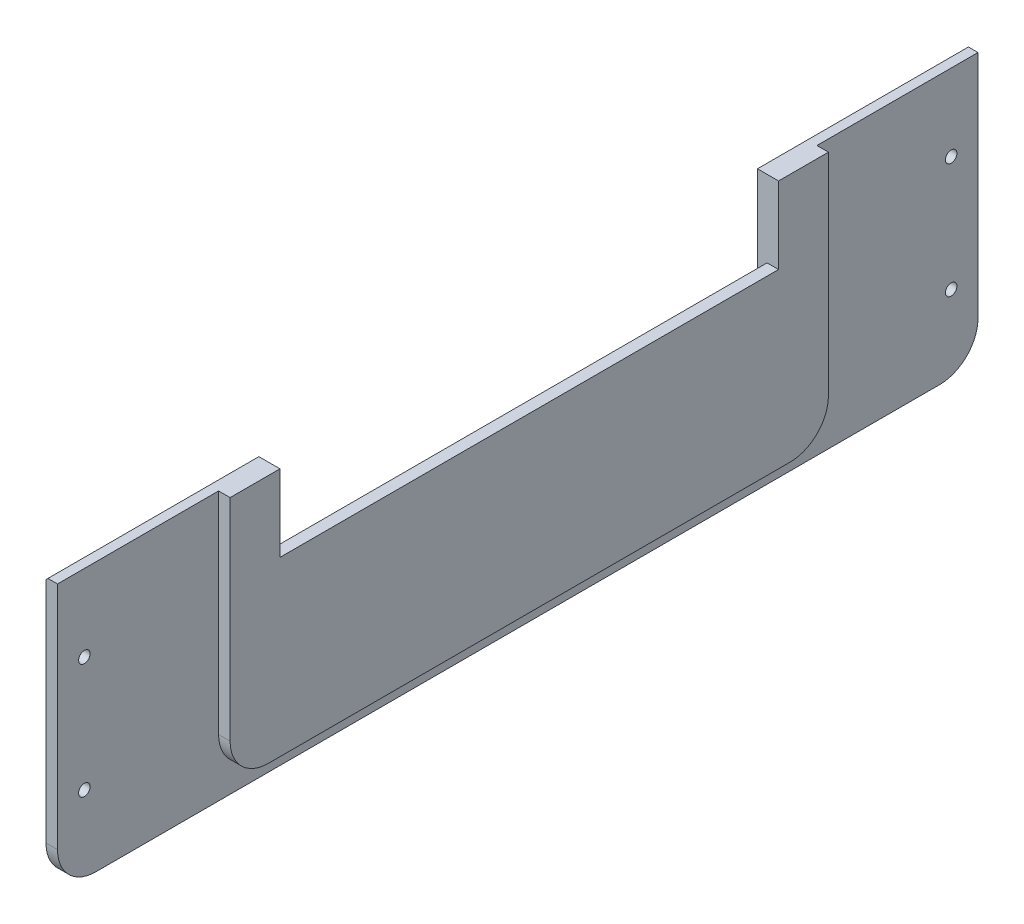
ISO-10303-21;
HEADER;
FILE_DESCRIPTION(('STEP AP214'),'2;1');
FILE_NAME('part.step','',(''),(''),'','','');
FILE_SCHEMA(('AUTOMOTIVE_DESIGN { 1 0 10303 214 1 1 1 1 }'));
ENDSEC;
DATA;
#1=APPLICATION_CONTEXT('core data for automotive mechanical design processes');
#2=APPLICATION_PROTOCOL_DEFINITION('international standard','automotive_design',2000,#1);
#3=PRODUCT_CONTEXT('',#1,'mechanical');
#4=PRODUCT('Part','Part','',(#3));
#5=PRODUCT_RELATED_PRODUCT_CATEGORY('part','',(#4));
#6=PRODUCT_DEFINITION_FORMATION('','',#4);
#7=PRODUCT_DEFINITION_CONTEXT('part definition',#1,'design');
#8=PRODUCT_DEFINITION('design','',#6,#7);
#9=PRODUCT_DEFINITION_SHAPE('','',#8);
#10=(LENGTH_UNIT() NAMED_UNIT(*) SI_UNIT(.MILLI.,.METRE.));
#11=(NAMED_UNIT(*) PLANE_ANGLE_UNIT() SI_UNIT($,.RADIAN.));
#12=(NAMED_UNIT(*) SI_UNIT($,.STERADIAN.) SOLID_ANGLE_UNIT());
#13=UNCERTAINTY_MEASURE_WITH_UNIT(LENGTH_MEASURE(1.E-05),#10,'distance_accuracy_value','');
#14=(GEOMETRIC_REPRESENTATION_CONTEXT(3) GLOBAL_UNCERTAINTY_ASSIGNED_CONTEXT((#13)) GLOBAL_UNIT_ASSIGNED_CONTEXT((#10,
#11,#12)) REPRESENTATION_CONTEXT('',''));
#15=CARTESIAN_POINT('',(0.,0.,0.));
#16=DIRECTION('',(0.,0.,1.));
#17=DIRECTION('',(1.,0.,0.));
#18=AXIS2_PLACEMENT_3D('',#15,#16,#17);
#19=CARTESIAN_POINT('',(3.,45.,120.));
#20=DIRECTION('',(0.,-1.,0.));
#21=DIRECTION('',(0.,0.,-1.));
#22=AXIS2_PLACEMENT_3D('',#19,#20,#21);
#23=PLANE('',#22);
#24=DIRECTION('',(-1.,0.,0.));
#25=VECTOR('',#24,1.);
#26=CARTESIAN_POINT('',(3.,45.,-120.));
#27=LINE('',#26,#25);
#28=CARTESIAN_POINT('',(3.,45.,-120.));
#29=VERTEX_POINT('',#28);
#30=CARTESIAN_POINT('',(0.499999999999973,45.,-120.));
#31=VERTEX_POINT('',#30);
#32=EDGE_CURVE('E349',#29,#31,#27,.T.);
#33=ORIENTED_EDGE('',*,*,#32,.T.);
#34=DIRECTION('',(0.,0.,1.));
#35=VECTOR('',#34,1.);
#36=CARTESIAN_POINT('',(0.499999999999973,45.,120.));
#37=LINE('',#36,#35);
#38=CARTESIAN_POINT('',(0.499999999999973,45.,-65.));
#39=VERTEX_POINT('',#38);
#40=EDGE_CURVE('E419',#31,#39,#37,.T.);
#41=ORIENTED_EDGE('',*,*,#40,.T.);
#42=DIRECTION('',(-1.,0.,0.));
#43=VECTOR('',#42,1.);
#44=CARTESIAN_POINT('',(3.,45.,-65.));
#45=LINE('',#44,#43);
#46=CARTESIAN_POINT('',(6.,45.,-65.));
#47=VERTEX_POINT('',#46);
#48=EDGE_CURVE('E239',#47,#39,#45,.T.);
#49=ORIENTED_EDGE('',*,*,#48,.F.);
#50=DIRECTION('',(0.,0.,1.));
#51=VECTOR('',#50,1.);
#52=CARTESIAN_POINT('',(6.,45.,78.));
#53=LINE('',#52,#51);
#54=CARTESIAN_POINT('',(6.,45.,-78.));
#55=VERTEX_POINT('',#54);
#56=EDGE_CURVE('E218',#55,#47,#53,.T.);
#57=ORIENTED_EDGE('',*,*,#56,.F.);
#58=DIRECTION('',(-1.,0.,0.));
#59=VECTOR('',#58,1.);
#60=CARTESIAN_POINT('',(6.,45.,-78.));
#61=LINE('',#60,#59);
#62=CARTESIAN_POINT('',(3.,45.,-78.));
#63=VERTEX_POINT('',#62);
#64=EDGE_CURVE('E314',#55,#63,#61,.T.);
#65=ORIENTED_EDGE('',*,*,#64,.T.);
#66=DIRECTION('',(0.,0.,1.));
#67=VECTOR('',#66,1.);
#68=CARTESIAN_POINT('',(3.,45.,120.));
#69=LINE('',#68,#67);
#70=EDGE_CURVE('E332',#29,#63,#69,.T.);
#71=ORIENTED_EDGE('',*,*,#70,.F.);
#72=EDGE_LOOP('',(#33,#41,#49,#57,#65,#71));
#73=FACE_BOUND('',#72,.T.);
#74=ADVANCED_FACE('F47',(#73),#23,.F.);
#75=CARTESIAN_POINT('',(3.,45.,120.));
#76=DIRECTION('',(0.,0.,-1.));
#77=DIRECTION('',(0.,1.,0.));
#78=AXIS2_PLACEMENT_3D('',#75,#76,#77);
#79=PLANE('',#78);
#80=DIRECTION('',(-1.,0.,0.));
#81=VECTOR('',#80,1.);
#82=CARTESIAN_POINT('',(3.,45.,120.));
#83=LINE('',#82,#81);
#84=CARTESIAN_POINT('',(3.,45.,120.));
#85=VERTEX_POINT('',#84);
#86=CARTESIAN_POINT('',(0.499999999999973,45.,120.));
#87=VERTEX_POINT('',#86);
#88=EDGE_CURVE('E336',#85,#87,#83,.T.);
#89=ORIENTED_EDGE('',*,*,#88,.T.);
#90=DIRECTION('',(0.707106781186548,0.707106781186548,0.));
#91=VECTOR('',#90,1.);
#92=CARTESIAN_POINT('',(0.499999999999973,45.,120.));
#93=LINE('',#92,#91);
#94=CARTESIAN_POINT('',(0.,44.5,120.));
#95=VERTEX_POINT('',#94);
#96=EDGE_CURVE('E410',#87,#95,#93,.F.);
#97=ORIENTED_EDGE('',*,*,#96,.T.);
#98=DIRECTION('',(0.,-1.,0.));
#99=VECTOR('',#98,1.);
#100=CARTESIAN_POINT('',(0.,45.,120.));
#101=LINE('',#100,#99);
#102=CARTESIAN_POINT('',(0.,-15.,120.));
#103=VERTEX_POINT('',#102);
#104=EDGE_CURVE('E318',#95,#103,#101,.T.);
#105=ORIENTED_EDGE('',*,*,#104,.T.);
#106=DIRECTION('',(-1.,0.,0.));
#107=VECTOR('',#106,1.);
#108=CARTESIAN_POINT('',(3.,-15.,120.));
#109=LINE('',#108,#107);
#110=CARTESIAN_POINT('',(3.,-15.,120.));
#111=VERTEX_POINT('',#110);
#112=EDGE_CURVE('E367',#103,#111,#109,.F.);
#113=ORIENTED_EDGE('',*,*,#112,.T.);
#114=DIRECTION('',(0.,-1.,0.));
#115=VECTOR('',#114,1.);
#116=CARTESIAN_POINT('',(3.,45.,120.));
#117=LINE('',#116,#115);
#118=EDGE_CURVE('E319',#85,#111,#117,.T.);
#119=ORIENTED_EDGE('',*,*,#118,.F.);
#120=EDGE_LOOP('',(#89,#97,#105,#113,#119));
#121=FACE_BOUND('',#120,.T.);
#122=ADVANCED_FACE('F511',(#121),#79,.F.);
#123=CARTESIAN_POINT('',(3.,-25.,120.));
#124=DIRECTION('',(0.,1.,0.));
#125=DIRECTION('',(0.,0.,1.));
#126=AXIS2_PLACEMENT_3D('',#123,#124,#125);
#127=PLANE('',#126);
#128=DIRECTION('',(0.,0.,-1.));
#129=VECTOR('',#128,1.);
#130=CARTESIAN_POINT('',(3.,-25.,120.));
#131=LINE('',#130,#129);
#132=CARTESIAN_POINT('',(3.,-25.,110.));
#133=VERTEX_POINT('',#132);
#134=CARTESIAN_POINT('',(3.,-25.,-110.));
#135=VERTEX_POINT('',#134);
#136=EDGE_CURVE('E323',#133,#135,#131,.T.);
#137=ORIENTED_EDGE('',*,*,#136,.F.);
#138=DIRECTION('',(-1.,0.,0.));
#139=VECTOR('',#138,1.);
#140=CARTESIAN_POINT('',(3.,-25.,110.));
#141=LINE('',#140,#139);
#142=CARTESIAN_POINT('',(0.,-25.,110.));
#143=VERTEX_POINT('',#142);
#144=EDGE_CURVE('E356',#133,#143,#141,.T.);
#145=ORIENTED_EDGE('',*,*,#144,.T.);
#146=DIRECTION('',(0.,0.,-1.));
#147=VECTOR('',#146,1.);
#148=CARTESIAN_POINT('',(0.,-25.,120.));
#149=LINE('',#148,#147);
#150=CARTESIAN_POINT('',(0.,-25.,-110.));
#151=VERTEX_POINT('',#150);
#152=EDGE_CURVE('E339',#143,#151,#149,.T.);
#153=ORIENTED_EDGE('',*,*,#152,.T.);
#154=DIRECTION('',(-1.,0.,0.));
#155=VECTOR('',#154,1.);
#156=CARTESIAN_POINT('',(3.,-25.,-110.));
#157=LINE('',#156,#155);
#158=EDGE_CURVE('E353',#151,#135,#157,.F.);
#159=ORIENTED_EDGE('',*,*,#158,.T.);
#160=EDGE_LOOP('',(#137,#145,#153,#159));
#161=FACE_BOUND('',#160,.T.);
#162=ADVANCED_FACE('F485',(#161),#127,.F.);
#163=CARTESIAN_POINT('',(3.,45.,-120.));
#164=DIRECTION('',(0.,0.,1.));
#165=DIRECTION('',(1.,0.,0.));
#166=AXIS2_PLACEMENT_3D('',#163,#164,#165);
#167=PLANE('',#166);
#168=DIRECTION('',(0.,1.,0.));
#169=VECTOR('',#168,1.);
#170=CARTESIAN_POINT('',(0.,45.,-120.));
#171=LINE('',#170,#169);
#172=CARTESIAN_POINT('',(0.,-15.,-120.));
#173=VERTEX_POINT('',#172);
#174=CARTESIAN_POINT('',(0.,44.5,-120.));
#175=VERTEX_POINT('',#174);
#176=EDGE_CURVE('E324',#173,#175,#171,.T.);
#177=ORIENTED_EDGE('',*,*,#176,.T.);
#178=DIRECTION('',(-0.707106781186548,-0.707106781186548,0.));
#179=VECTOR('',#178,1.);
#180=CARTESIAN_POINT('',(0.499999999999973,45.,-120.));
#181=LINE('',#180,#179);
#182=EDGE_CURVE('E423',#175,#31,#181,.F.);
#183=ORIENTED_EDGE('',*,*,#182,.T.);
#184=ORIENTED_EDGE('',*,*,#32,.F.);
#185=DIRECTION('',(0.,1.,0.));
#186=VECTOR('',#185,1.);
#187=CARTESIAN_POINT('',(3.,45.,-120.));
#188=LINE('',#187,#186);
#189=CARTESIAN_POINT('',(3.,-15.,-120.));
#190=VERTEX_POINT('',#189);
#191=EDGE_CURVE('E328',#190,#29,#188,.T.);
#192=ORIENTED_EDGE('',*,*,#191,.F.);
#193=DIRECTION('',(-1.,0.,0.));
#194=VECTOR('',#193,1.);
#195=CARTESIAN_POINT('',(3.,-15.,-120.));
#196=LINE('',#195,#194);
#197=EDGE_CURVE('E376',#190,#173,#196,.T.);
#198=ORIENTED_EDGE('',*,*,#197,.T.);
#199=EDGE_LOOP('',(#177,#183,#184,#192,#198));
#200=FACE_BOUND('',#199,.T.);
#201=ADVANCED_FACE('F469',(#200),#167,.F.);
#202=DIRECTION('',(-1.,0.,0.));
#203=VECTOR('',#202,1.);
#204=CARTESIAN_POINT('',(3.,45.,65.));
#205=LINE('',#204,#203);
#206=CARTESIAN_POINT('',(6.,45.,65.));
#207=VERTEX_POINT('',#206);
#208=CARTESIAN_POINT('',(0.499999999999973,45.,65.));
#209=VERTEX_POINT('',#208);
#210=EDGE_CURVE('E240',#207,#209,#205,.T.);
#211=ORIENTED_EDGE('',*,*,#210,.T.);
#212=DIRECTION('',(0.,0.,1.));
#213=VECTOR('',#212,1.);
#214=CARTESIAN_POINT('',(0.499999999999973,45.,120.));
#215=LINE('',#214,#213);
#216=EDGE_CURVE('E406',#209,#87,#215,.T.);
#217=ORIENTED_EDGE('',*,*,#216,.T.);
#218=ORIENTED_EDGE('',*,*,#88,.F.);
#219=CARTESIAN_POINT('',(3.,45.,78.));
#220=VERTEX_POINT('',#219);
#221=EDGE_CURVE('E331',#220,#85,#69,.T.);
#222=ORIENTED_EDGE('',*,*,#221,.F.);
#223=DIRECTION('',(-1.,0.,0.));
#224=VECTOR('',#223,1.);
#225=CARTESIAN_POINT('',(6.,45.,78.));
#226=LINE('',#225,#224);
#227=CARTESIAN_POINT('',(6.,45.,78.));
#228=VERTEX_POINT('',#227);
#229=EDGE_CURVE('E301',#228,#220,#226,.T.);
#230=ORIENTED_EDGE('',*,*,#229,.F.);
#231=EDGE_CURVE('E298',#207,#228,#53,.T.);
#232=ORIENTED_EDGE('',*,*,#231,.F.);
#233=EDGE_LOOP('',(#211,#217,#218,#222,#230,#232));
#234=FACE_BOUND('',#233,.T.);
#235=ADVANCED_FACE('F503',(#234),#23,.F.);
#236=CARTESIAN_POINT('',(3.,0.,0.));
#237=DIRECTION('',(1.,0.,0.));
#238=DIRECTION('',(0.,0.,-1.));
#239=AXIS2_PLACEMENT_3D('',#236,#237,#238);
#240=PLANE('',#239);
#241=CARTESIAN_POINT('',(3.,25.,-113.));
#242=DIRECTION('',(1.,0.,0.));
#243=DIRECTION('',(0.,0.,-1.));
#244=AXIS2_PLACEMENT_3D('',#241,#242,#243);
#245=CIRCLE('',#244,1.5);
#246=CARTESIAN_POINT('',(3.,25.,-114.5));
#247=VERTEX_POINT('',#246);
#248=EDGE_CURVE('E281',#247,#247,#245,.T.);
#249=ORIENTED_EDGE('',*,*,#248,.F.);
#250=EDGE_LOOP('',(#249));
#251=FACE_BOUND('',#250,.T.);
#252=CARTESIAN_POINT('',(3.,-5.00000000000003,-113.));
#253=DIRECTION('',(1.,0.,0.));
#254=DIRECTION('',(0.,0.,-1.));
#255=AXIS2_PLACEMENT_3D('',#252,#253,#254);
#256=CIRCLE('',#255,1.5);
#257=CARTESIAN_POINT('',(3.,-5.00000000000003,-114.5));
#258=VERTEX_POINT('',#257);
#259=EDGE_CURVE('E277',#258,#258,#256,.T.);
#260=ORIENTED_EDGE('',*,*,#259,.F.);
#261=EDGE_LOOP('',(#260));
#262=FACE_BOUND('',#261,.T.);
#263=CARTESIAN_POINT('',(3.,-5.,113.));
#264=DIRECTION('',(1.,0.,0.));
#265=DIRECTION('',(0.,0.,-1.));
#266=AXIS2_PLACEMENT_3D('',#263,#264,#265);
#267=CIRCLE('',#266,1.5);
#268=CARTESIAN_POINT('',(3.,-5.,111.5));
#269=VERTEX_POINT('',#268);
#270=EDGE_CURVE('E273',#269,#269,#267,.T.);
#271=ORIENTED_EDGE('',*,*,#270,.F.);
#272=EDGE_LOOP('',(#271));
#273=FACE_BOUND('',#272,.T.);
#274=CARTESIAN_POINT('',(3.,25.,113.));
#275=DIRECTION('',(1.,0.,0.));
#276=DIRECTION('',(0.,0.,-1.));
#277=AXIS2_PLACEMENT_3D('',#274,#275,#276);
#278=CIRCLE('',#277,1.5);
#279=CARTESIAN_POINT('',(3.,25.,111.5));
#280=VERTEX_POINT('',#279);
#281=EDGE_CURVE('E269',#280,#280,#278,.T.);
#282=ORIENTED_EDGE('',*,*,#281,.F.);
#283=EDGE_LOOP('',(#282));
#284=FACE_BOUND('',#283,.T.);
#285=ORIENTED_EDGE('',*,*,#118,.T.);
#286=CARTESIAN_POINT('',(3.,-15.,110.));
#287=DIRECTION('',(1.,0.,0.));
#288=DIRECTION('',(0.,0.,-1.));
#289=AXIS2_PLACEMENT_3D('',#286,#287,#288);
#290=CIRCLE('',#289,10.);
#291=EDGE_CURVE('E373',#111,#133,#290,.T.);
#292=ORIENTED_EDGE('',*,*,#291,.T.);
#293=ORIENTED_EDGE('',*,*,#136,.T.);
#294=CARTESIAN_POINT('',(3.,-15.,-110.));
#295=DIRECTION('',(1.,0.,0.));
#296=DIRECTION('',(0.,0.,-1.));
#297=AXIS2_PLACEMENT_3D('',#294,#295,#296);
#298=CIRCLE('',#297,10.);
#299=EDGE_CURVE('E370',#135,#190,#298,.T.);
#300=ORIENTED_EDGE('',*,*,#299,.T.);
#301=ORIENTED_EDGE('',*,*,#191,.T.);
#302=ORIENTED_EDGE('',*,*,#70,.T.);
#303=DIRECTION('',(0.,1.,0.));
#304=VECTOR('',#303,1.);
#305=CARTESIAN_POINT('',(3.,45.,-78.));
#306=LINE('',#305,#304);
#307=CARTESIAN_POINT('',(3.,-9.99999999999999,-78.));
#308=VERTEX_POINT('',#307);
#309=EDGE_CURVE('E291',#308,#63,#306,.T.);
#310=ORIENTED_EDGE('',*,*,#309,.F.);
#311=CARTESIAN_POINT('',(3.,-9.99999999999999,-68.));
#312=DIRECTION('',(1.,0.,0.));
#313=DIRECTION('',(0.,0.,-1.));
#314=AXIS2_PLACEMENT_3D('',#311,#312,#313);
#315=CIRCLE('',#314,10.);
#316=CARTESIAN_POINT('',(3.,-20.,-68.));
#317=VERTEX_POINT('',#316);
#318=EDGE_CURVE('E403',#308,#317,#315,.F.);
#319=ORIENTED_EDGE('',*,*,#318,.T.);
#320=DIRECTION('',(0.,0.,-1.));
#321=VECTOR('',#320,1.);
#322=CARTESIAN_POINT('',(3.,-20.,78.));
#323=LINE('',#322,#321);
#324=CARTESIAN_POINT('',(3.,-20.,68.));
#325=VERTEX_POINT('',#324);
#326=EDGE_CURVE('E305',#325,#317,#323,.T.);
#327=ORIENTED_EDGE('',*,*,#326,.F.);
#328=CARTESIAN_POINT('',(3.,-10.,68.));
#329=DIRECTION('',(1.,0.,0.));
#330=DIRECTION('',(0.,0.,-1.));
#331=AXIS2_PLACEMENT_3D('',#328,#329,#330);
#332=CIRCLE('',#331,10.);
#333=CARTESIAN_POINT('',(3.,-9.99999999999999,78.));
#334=VERTEX_POINT('',#333);
#335=EDGE_CURVE('E400',#325,#334,#332,.F.);
#336=ORIENTED_EDGE('',*,*,#335,.T.);
#337=DIRECTION('',(0.,-1.,0.));
#338=VECTOR('',#337,1.);
#339=CARTESIAN_POINT('',(3.,45.,78.));
#340=LINE('',#339,#338);
#341=EDGE_CURVE('E285',#220,#334,#340,.T.);
#342=ORIENTED_EDGE('',*,*,#341,.F.);
#343=ORIENTED_EDGE('',*,*,#221,.T.);
#344=EDGE_LOOP('',(#285,#292,#293,#300,#301,#302,#310,#319,#327,#336,#342,#343));
#345=FACE_BOUND('',#344,.T.);
#346=ADVANCED_FACE('F476',(#251,#262,#273,#284,#345),#240,.T.);
#347=CARTESIAN_POINT('',(0.,0.,0.));
#348=DIRECTION('',(1.,0.,0.));
#349=DIRECTION('',(0.,0.,-1.));
#350=AXIS2_PLACEMENT_3D('',#347,#348,#349);
#351=PLANE('',#350);
#352=CARTESIAN_POINT('',(0.,25.,-113.));
#353=DIRECTION('',(-1.,0.,0.));
#354=DIRECTION('',(0.,0.,-1.));
#355=AXIS2_PLACEMENT_3D('',#352,#353,#354);
#356=CIRCLE('',#355,1.5);
#357=CARTESIAN_POINT('',(0.,25.,-114.5));
#358=VERTEX_POINT('',#357);
#359=EDGE_CURVE('E244',#358,#358,#356,.T.);
#360=ORIENTED_EDGE('',*,*,#359,.F.);
#361=EDGE_LOOP('',(#360));
#362=FACE_BOUND('',#361,.T.);
#363=CARTESIAN_POINT('',(0.,-5.00000000000003,-113.));
#364=DIRECTION('',(-1.,0.,0.));
#365=DIRECTION('',(0.,0.,-1.));
#366=AXIS2_PLACEMENT_3D('',#363,#364,#365);
#367=CIRCLE('',#366,1.5);
#368=CARTESIAN_POINT('',(0.,-5.00000000000003,-114.5));
#369=VERTEX_POINT('',#368);
#370=EDGE_CURVE('E259',#369,#369,#367,.T.);
#371=ORIENTED_EDGE('',*,*,#370,.F.);
#372=EDGE_LOOP('',(#371));
#373=FACE_BOUND('',#372,.T.);
#374=CARTESIAN_POINT('',(0.,-5.,113.));
#375=DIRECTION('',(-1.,0.,0.));
#376=DIRECTION('',(0.,0.,1.));
#377=AXIS2_PLACEMENT_3D('',#374,#375,#376);
#378=CIRCLE('',#377,1.5);
#379=CARTESIAN_POINT('',(0.,-5.,114.5));
#380=VERTEX_POINT('',#379);
#381=EDGE_CURVE('E254',#380,#380,#378,.T.);
#382=ORIENTED_EDGE('',*,*,#381,.F.);
#383=EDGE_LOOP('',(#382));
#384=FACE_BOUND('',#383,.T.);
#385=CARTESIAN_POINT('',(0.,25.,113.));
#386=DIRECTION('',(-1.,0.,0.));
#387=DIRECTION('',(0.,0.,1.));
#388=AXIS2_PLACEMENT_3D('',#385,#386,#387);
#389=CIRCLE('',#388,1.5);
#390=CARTESIAN_POINT('',(0.,25.,114.5));
#391=VERTEX_POINT('',#390);
#392=EDGE_CURVE('E258',#391,#391,#389,.T.);
#393=ORIENTED_EDGE('',*,*,#392,.F.);
#394=EDGE_LOOP('',(#393));
#395=FACE_BOUND('',#394,.T.);
#396=DIRECTION('',(0.,0.,-1.));
#397=VECTOR('',#396,1.);
#398=CARTESIAN_POINT('',(0.,44.5,0.));
#399=LINE('',#398,#397);
#400=CARTESIAN_POINT('',(0.,44.5,65.5));
#401=VERTEX_POINT('',#400);
#402=EDGE_CURVE('E416',#95,#401,#399,.T.);
#403=ORIENTED_EDGE('',*,*,#402,.T.);
#404=DIRECTION('',(0.,-1.,0.));
#405=VECTOR('',#404,1.);
#406=CARTESIAN_POINT('',(0.,0.,65.5));
#407=LINE('',#406,#405);
#408=CARTESIAN_POINT('',(0.,9.50000000000003,65.5));
#409=VERTEX_POINT('',#408);
#410=EDGE_CURVE('E73',#401,#409,#407,.T.);
#411=ORIENTED_EDGE('',*,*,#410,.T.);
#412=DIRECTION('',(0.,0.,-1.));
#413=VECTOR('',#412,1.);
#414=CARTESIAN_POINT('',(0.,9.50000000000003,0.));
#415=LINE('',#414,#413);
#416=CARTESIAN_POINT('',(0.,9.50000000000003,-65.5));
#417=VERTEX_POINT('',#416);
#418=EDGE_CURVE('E436',#409,#417,#415,.T.);
#419=ORIENTED_EDGE('',*,*,#418,.T.);
#420=DIRECTION('',(0.,1.,0.));
#421=VECTOR('',#420,1.);
#422=CARTESIAN_POINT('',(0.,0.,-65.5));
#423=LINE('',#422,#421);
#424=CARTESIAN_POINT('',(0.,44.5,-65.5));
#425=VERTEX_POINT('',#424);
#426=EDGE_CURVE('E433',#417,#425,#423,.T.);
#427=ORIENTED_EDGE('',*,*,#426,.T.);
#428=DIRECTION('',(0.,0.,-1.));
#429=VECTOR('',#428,1.);
#430=CARTESIAN_POINT('',(0.,44.5,0.));
#431=LINE('',#430,#429);
#432=EDGE_CURVE('E413',#425,#175,#431,.T.);
#433=ORIENTED_EDGE('',*,*,#432,.T.);
#434=ORIENTED_EDGE('',*,*,#176,.F.);
#435=CARTESIAN_POINT('',(0.,-15.,-110.));
#436=DIRECTION('',(1.,0.,0.));
#437=DIRECTION('',(0.,0.,-1.));
#438=AXIS2_PLACEMENT_3D('',#435,#436,#437);
#439=CIRCLE('',#438,10.);
#440=EDGE_CURVE('E360',#173,#151,#439,.F.);
#441=ORIENTED_EDGE('',*,*,#440,.T.);
#442=ORIENTED_EDGE('',*,*,#152,.F.);
#443=CARTESIAN_POINT('',(0.,-15.,110.));
#444=DIRECTION('',(1.,0.,0.));
#445=DIRECTION('',(0.,0.,-1.));
#446=AXIS2_PLACEMENT_3D('',#443,#444,#445);
#447=CIRCLE('',#446,10.);
#448=EDGE_CURVE('E363',#143,#103,#447,.F.);
#449=ORIENTED_EDGE('',*,*,#448,.T.);
#450=ORIENTED_EDGE('',*,*,#104,.F.);
#451=EDGE_LOOP('',(#403,#411,#419,#427,#433,#434,#441,#442,#449,#450));
#452=FACE_BOUND('',#451,.T.);
#453=ADVANCED_FACE('F461',(#362,#373,#384,#395,#452),#351,.F.);
#454=CARTESIAN_POINT('',(6.,45.,78.));
#455=DIRECTION('',(0.,0.,-1.));
#456=DIRECTION('',(0.,1.,0.));
#457=AXIS2_PLACEMENT_3D('',#454,#455,#456);
#458=PLANE('',#457);
#459=ORIENTED_EDGE('',*,*,#341,.T.);
#460=DIRECTION('',(-1.,0.,0.));
#461=VECTOR('',#460,1.);
#462=CARTESIAN_POINT('',(6.,-9.99999999999999,78.));
#463=LINE('',#462,#461);
#464=CARTESIAN_POINT('',(6.,-9.99999999999999,78.));
#465=VERTEX_POINT('',#464);
#466=EDGE_CURVE('E387',#334,#465,#463,.F.);
#467=ORIENTED_EDGE('',*,*,#466,.T.);
#468=DIRECTION('',(0.,-1.,0.));
#469=VECTOR('',#468,1.);
#470=CARTESIAN_POINT('',(6.,45.,78.));
#471=LINE('',#470,#469);
#472=EDGE_CURVE('E286',#228,#465,#471,.T.);
#473=ORIENTED_EDGE('',*,*,#472,.F.);
#474=ORIENTED_EDGE('',*,*,#229,.T.);
#475=EDGE_LOOP('',(#459,#467,#473,#474));
#476=FACE_BOUND('',#475,.T.);
#477=ADVANCED_FACE('F603',(#476),#458,.F.);
#478=CARTESIAN_POINT('',(6.,-20.,78.));
#479=DIRECTION('',(0.,1.,0.));
#480=DIRECTION('',(0.,0.,1.));
#481=AXIS2_PLACEMENT_3D('',#478,#479,#480);
#482=PLANE('',#481);
#483=DIRECTION('',(0.,0.,-1.));
#484=VECTOR('',#483,1.);
#485=CARTESIAN_POINT('',(6.,-20.,78.));
#486=LINE('',#485,#484);
#487=CARTESIAN_POINT('',(6.,-20.,68.));
#488=VERTEX_POINT('',#487);
#489=CARTESIAN_POINT('',(6.,-20.,-68.));
#490=VERTEX_POINT('',#489);
#491=EDGE_CURVE('E290',#488,#490,#486,.T.);
#492=ORIENTED_EDGE('',*,*,#491,.F.);
#493=DIRECTION('',(-1.,0.,0.));
#494=VECTOR('',#493,1.);
#495=CARTESIAN_POINT('',(6.,-20.,68.));
#496=LINE('',#495,#494);
#497=EDGE_CURVE('E383',#488,#325,#496,.T.);
#498=ORIENTED_EDGE('',*,*,#497,.T.);
#499=ORIENTED_EDGE('',*,*,#326,.T.);
#500=DIRECTION('',(-1.,0.,0.));
#501=VECTOR('',#500,1.);
#502=CARTESIAN_POINT('',(6.,-20.,-68.));
#503=LINE('',#502,#501);
#504=EDGE_CURVE('E380',#317,#490,#503,.F.);
#505=ORIENTED_EDGE('',*,*,#504,.T.);
#506=EDGE_LOOP('',(#492,#498,#499,#505));
#507=FACE_BOUND('',#506,.T.);
#508=ADVANCED_FACE('F648',(#507),#482,.F.);
#509=CARTESIAN_POINT('',(6.,45.,-78.));
#510=DIRECTION('',(0.,0.,1.));
#511=DIRECTION('',(0.,-1.,0.));
#512=AXIS2_PLACEMENT_3D('',#509,#510,#511);
#513=PLANE('',#512);
#514=DIRECTION('',(0.,1.,0.));
#515=VECTOR('',#514,1.);
#516=CARTESIAN_POINT('',(6.,45.,-78.));
#517=LINE('',#516,#515);
#518=CARTESIAN_POINT('',(6.,-9.99999999999999,-78.));
#519=VERTEX_POINT('',#518);
#520=EDGE_CURVE('E295',#519,#55,#517,.T.);
#521=ORIENTED_EDGE('',*,*,#520,.F.);
#522=DIRECTION('',(-1.,0.,0.));
#523=VECTOR('',#522,1.);
#524=CARTESIAN_POINT('',(6.,-9.99999999999999,-78.));
#525=LINE('',#524,#523);
#526=EDGE_CURVE('E396',#519,#308,#525,.T.);
#527=ORIENTED_EDGE('',*,*,#526,.T.);
#528=ORIENTED_EDGE('',*,*,#309,.T.);
#529=ORIENTED_EDGE('',*,*,#64,.F.);
#530=EDGE_LOOP('',(#521,#527,#528,#529));
#531=FACE_BOUND('',#530,.T.);
#532=ADVANCED_FACE('F657',(#531),#513,.F.);
#533=CARTESIAN_POINT('',(6.,0.,0.));
#534=DIRECTION('',(1.,0.,0.));
#535=DIRECTION('',(0.,0.,-1.));
#536=AXIS2_PLACEMENT_3D('',#533,#534,#535);
#537=PLANE('',#536);
#538=DIRECTION('',(0.,-1.,0.));
#539=VECTOR('',#538,1.);
#540=CARTESIAN_POINT('',(6.,45.,-65.));
#541=LINE('',#540,#539);
#542=CARTESIAN_POINT('',(6.,25.,-65.));
#543=VERTEX_POINT('',#542);
#544=EDGE_CURVE('E198',#47,#543,#541,.T.);
#545=ORIENTED_EDGE('',*,*,#544,.T.);
#546=DIRECTION('',(0.,0.,1.));
#547=VECTOR('',#546,1.);
#548=CARTESIAN_POINT('',(6.,25.,-65.));
#549=LINE('',#548,#547);
#550=CARTESIAN_POINT('',(6.,25.,65.));
#551=VERTEX_POINT('',#550);
#552=EDGE_CURVE('E209',#543,#551,#549,.T.);
#553=ORIENTED_EDGE('',*,*,#552,.T.);
#554=DIRECTION('',(0.,1.,0.));
#555=VECTOR('',#554,1.);
#556=CARTESIAN_POINT('',(6.,45.,65.));
#557=LINE('',#556,#555);
#558=EDGE_CURVE('E206',#551,#207,#557,.T.);
#559=ORIENTED_EDGE('',*,*,#558,.T.);
#560=ORIENTED_EDGE('',*,*,#231,.T.);
#561=ORIENTED_EDGE('',*,*,#472,.T.);
#562=CARTESIAN_POINT('',(6.,-10.,68.));
#563=DIRECTION('',(1.,0.,0.));
#564=DIRECTION('',(0.,0.,-1.));
#565=AXIS2_PLACEMENT_3D('',#562,#563,#564);
#566=CIRCLE('',#565,10.);
#567=EDGE_CURVE('E393',#465,#488,#566,.T.);
#568=ORIENTED_EDGE('',*,*,#567,.T.);
#569=ORIENTED_EDGE('',*,*,#491,.T.);
#570=CARTESIAN_POINT('',(6.,-9.99999999999999,-68.));
#571=DIRECTION('',(1.,0.,0.));
#572=DIRECTION('',(0.,0.,-1.));
#573=AXIS2_PLACEMENT_3D('',#570,#571,#572);
#574=CIRCLE('',#573,10.);
#575=EDGE_CURVE('E390',#490,#519,#574,.T.);
#576=ORIENTED_EDGE('',*,*,#575,.T.);
#577=ORIENTED_EDGE('',*,*,#520,.T.);
#578=ORIENTED_EDGE('',*,*,#56,.T.);
#579=EDGE_LOOP('',(#545,#553,#559,#560,#561,#568,#569,#576,#577,#578));
#580=FACE_BOUND('',#579,.T.);
#581=ADVANCED_FACE('F216',(#580),#537,.T.);
#582=CARTESIAN_POINT('',(20.,25.,113.));
#583=DIRECTION('',(-1.,0.,0.));
#584=DIRECTION('',(0.,0.,1.));
#585=AXIS2_PLACEMENT_3D('',#582,#583,#584);
#586=CYLINDRICAL_SURFACE('',#585,1.5);
#587=ORIENTED_EDGE('',*,*,#281,.T.);
#588=EDGE_LOOP('',(#587));
#589=FACE_BOUND('',#588,.T.);
#590=ORIENTED_EDGE('',*,*,#392,.T.);
#591=EDGE_LOOP('',(#590));
#592=FACE_BOUND('',#591,.T.);
#593=ADVANCED_FACE('F684',(#589,#592),#586,.F.);
#594=CARTESIAN_POINT('',(20.,-5.,113.));
#595=DIRECTION('',(-1.,0.,0.));
#596=DIRECTION('',(0.,0.,1.));
#597=AXIS2_PLACEMENT_3D('',#594,#595,#596);
#598=CYLINDRICAL_SURFACE('',#597,1.5);
#599=ORIENTED_EDGE('',*,*,#270,.T.);
#600=EDGE_LOOP('',(#599));
#601=FACE_BOUND('',#600,.T.);
#602=ORIENTED_EDGE('',*,*,#381,.T.);
#603=EDGE_LOOP('',(#602));
#604=FACE_BOUND('',#603,.T.);
#605=ADVANCED_FACE('F716',(#601,#604),#598,.F.);
#606=CARTESIAN_POINT('',(20.,-5.00000000000003,-113.));
#607=DIRECTION('',(-1.,0.,0.));
#608=DIRECTION('',(0.,0.,1.));
#609=AXIS2_PLACEMENT_3D('',#606,#607,#608);
#610=CYLINDRICAL_SURFACE('',#609,1.5);
#611=ORIENTED_EDGE('',*,*,#259,.T.);
#612=EDGE_LOOP('',(#611));
#613=FACE_BOUND('',#612,.T.);
#614=ORIENTED_EDGE('',*,*,#370,.T.);
#615=EDGE_LOOP('',(#614));
#616=FACE_BOUND('',#615,.T.);
#617=ADVANCED_FACE('F719',(#613,#616),#610,.F.);
#618=CARTESIAN_POINT('',(20.,25.,-113.));
#619=DIRECTION('',(-1.,0.,0.));
#620=DIRECTION('',(0.,0.,1.));
#621=AXIS2_PLACEMENT_3D('',#618,#619,#620);
#622=CYLINDRICAL_SURFACE('',#621,1.5);
#623=ORIENTED_EDGE('',*,*,#248,.T.);
#624=EDGE_LOOP('',(#623));
#625=FACE_BOUND('',#624,.T.);
#626=ORIENTED_EDGE('',*,*,#359,.T.);
#627=EDGE_LOOP('',(#626));
#628=FACE_BOUND('',#627,.T.);
#629=ADVANCED_FACE('F526',(#625,#628),#622,.F.);
#630=CARTESIAN_POINT('',(3.,-15.,110.));
#631=DIRECTION('',(-1.,0.,0.));
#632=DIRECTION('',(0.,0.,1.));
#633=AXIS2_PLACEMENT_3D('',#630,#631,#632);
#634=CYLINDRICAL_SURFACE('',#633,10.);
#635=ORIENTED_EDGE('',*,*,#291,.F.);
#636=ORIENTED_EDGE('',*,*,#112,.F.);
#637=ORIENTED_EDGE('',*,*,#448,.F.);
#638=ORIENTED_EDGE('',*,*,#144,.F.);
#639=EDGE_LOOP('',(#635,#636,#637,#638));
#640=FACE_BOUND('',#639,.T.);
#641=ADVANCED_FACE('F489',(#640),#634,.T.);
#642=CARTESIAN_POINT('',(3.,-15.,-110.));
#643=DIRECTION('',(-1.,0.,0.));
#644=DIRECTION('',(0.,0.,1.));
#645=AXIS2_PLACEMENT_3D('',#642,#643,#644);
#646=CYLINDRICAL_SURFACE('',#645,10.);
#647=ORIENTED_EDGE('',*,*,#299,.F.);
#648=ORIENTED_EDGE('',*,*,#158,.F.);
#649=ORIENTED_EDGE('',*,*,#440,.F.);
#650=ORIENTED_EDGE('',*,*,#197,.F.);
#651=EDGE_LOOP('',(#647,#648,#649,#650));
#652=FACE_BOUND('',#651,.T.);
#653=ADVANCED_FACE('F480',(#652),#646,.T.);
#654=CARTESIAN_POINT('',(6.,-10.,68.));
#655=DIRECTION('',(-1.,0.,0.));
#656=DIRECTION('',(0.,0.,1.));
#657=AXIS2_PLACEMENT_3D('',#654,#655,#656);
#658=CYLINDRICAL_SURFACE('',#657,10.);
#659=ORIENTED_EDGE('',*,*,#567,.F.);
#660=ORIENTED_EDGE('',*,*,#466,.F.);
#661=ORIENTED_EDGE('',*,*,#335,.F.);
#662=ORIENTED_EDGE('',*,*,#497,.F.);
#663=EDGE_LOOP('',(#659,#660,#661,#662));
#664=FACE_BOUND('',#663,.T.);
#665=ADVANCED_FACE('F529',(#664),#658,.T.);
#666=CARTESIAN_POINT('',(6.,-9.99999999999999,-68.));
#667=DIRECTION('',(-1.,0.,0.));
#668=DIRECTION('',(0.,0.,1.));
#669=AXIS2_PLACEMENT_3D('',#666,#667,#668);
#670=CYLINDRICAL_SURFACE('',#669,10.);
#671=ORIENTED_EDGE('',*,*,#575,.F.);
#672=ORIENTED_EDGE('',*,*,#504,.F.);
#673=ORIENTED_EDGE('',*,*,#318,.F.);
#674=ORIENTED_EDGE('',*,*,#526,.F.);
#675=EDGE_LOOP('',(#671,#672,#673,#674));
#676=FACE_BOUND('',#675,.T.);
#677=ADVANCED_FACE('F532',(#676),#670,.T.);
#678=CARTESIAN_POINT('',(3.,10.,65.));
#679=DIRECTION('',(0.,0.,1.));
#680=DIRECTION('',(1.,0.,0.));
#681=AXIS2_PLACEMENT_3D('',#678,#679,#680);
#682=PLANE('',#681);
#683=DIRECTION('',(-1.,0.,0.));
#684=VECTOR('',#683,1.);
#685=CARTESIAN_POINT('',(3.,10.,65.));
#686=LINE('',#685,#684);
#687=CARTESIAN_POINT('',(3.,10.,65.));
#688=VERTEX_POINT('',#687);
#689=CARTESIAN_POINT('',(0.499999999999973,10.,65.));
#690=VERTEX_POINT('',#689);
#691=EDGE_CURVE('E245',#688,#690,#686,.T.);
#692=ORIENTED_EDGE('',*,*,#691,.T.);
#693=DIRECTION('',(0.,1.,0.));
#694=VECTOR('',#693,1.);
#695=CARTESIAN_POINT('',(0.499999999999973,10.,65.));
#696=LINE('',#695,#694);
#697=EDGE_CURVE('E426',#690,#209,#696,.T.);
#698=ORIENTED_EDGE('',*,*,#697,.T.);
#699=ORIENTED_EDGE('',*,*,#210,.F.);
#700=ORIENTED_EDGE('',*,*,#558,.F.);
#701=DIRECTION('',(-1.,0.,0.));
#702=VECTOR('',#701,1.);
#703=CARTESIAN_POINT('',(6.,25.,65.));
#704=LINE('',#703,#702);
#705=CARTESIAN_POINT('',(3.,25.,65.));
#706=VERTEX_POINT('',#705);
#707=EDGE_CURVE('E205',#551,#706,#704,.T.);
#708=ORIENTED_EDGE('',*,*,#707,.T.);
#709=DIRECTION('',(0.,1.,0.));
#710=VECTOR('',#709,1.);
#711=CARTESIAN_POINT('',(3.,10.,65.));
#712=LINE('',#711,#710);
#713=EDGE_CURVE('E235',#688,#706,#712,.T.);
#714=ORIENTED_EDGE('',*,*,#713,.F.);
#715=EDGE_LOOP('',(#692,#698,#699,#700,#708,#714));
#716=FACE_BOUND('',#715,.T.);
#717=ADVANCED_FACE('F499',(#716),#682,.F.);
#718=CARTESIAN_POINT('',(3.,10.,-65.));
#719=DIRECTION('',(0.,-1.,0.));
#720=DIRECTION('',(0.,0.,-1.));
#721=AXIS2_PLACEMENT_3D('',#718,#719,#720);
#722=PLANE('',#721);
#723=DIRECTION('',(-1.,0.,0.));
#724=VECTOR('',#723,1.);
#725=CARTESIAN_POINT('',(3.,10.,-65.));
#726=LINE('',#725,#724);
#727=CARTESIAN_POINT('',(3.,10.,-65.));
#728=VERTEX_POINT('',#727);
#729=CARTESIAN_POINT('',(0.499999999999973,10.,-65.));
#730=VERTEX_POINT('',#729);
#731=EDGE_CURVE('E249',#728,#730,#726,.T.);
#732=ORIENTED_EDGE('',*,*,#731,.T.);
#733=DIRECTION('',(0.,0.,1.));
#734=VECTOR('',#733,1.);
#735=CARTESIAN_POINT('',(0.499999999999973,10.,-65.));
#736=LINE('',#735,#734);
#737=EDGE_CURVE('E441',#730,#690,#736,.T.);
#738=ORIENTED_EDGE('',*,*,#737,.T.);
#739=ORIENTED_EDGE('',*,*,#691,.F.);
#740=DIRECTION('',(0.,0.,1.));
#741=VECTOR('',#740,1.);
#742=CARTESIAN_POINT('',(3.,10.,-65.));
#743=LINE('',#742,#741);
#744=EDGE_CURVE('E231',#728,#688,#743,.T.);
#745=ORIENTED_EDGE('',*,*,#744,.F.);
#746=EDGE_LOOP('',(#732,#738,#739,#745));
#747=FACE_BOUND('',#746,.T.);
#748=ADVANCED_FACE('F579',(#747),#722,.F.);
#749=CARTESIAN_POINT('',(3.,45.,-65.));
#750=DIRECTION('',(0.,0.,-1.));
#751=DIRECTION('',(-1.,0.,0.));
#752=AXIS2_PLACEMENT_3D('',#749,#750,#751);
#753=PLANE('',#752);
#754=ORIENTED_EDGE('',*,*,#48,.T.);
#755=DIRECTION('',(0.,-1.,0.));
#756=VECTOR('',#755,1.);
#757=CARTESIAN_POINT('',(0.499999999999973,45.,-65.));
#758=LINE('',#757,#756);
#759=EDGE_CURVE('E58',#39,#730,#758,.T.);
#760=ORIENTED_EDGE('',*,*,#759,.T.);
#761=ORIENTED_EDGE('',*,*,#731,.F.);
#762=DIRECTION('',(0.,-1.,0.));
#763=VECTOR('',#762,1.);
#764=CARTESIAN_POINT('',(3.,45.,-65.));
#765=LINE('',#764,#763);
#766=CARTESIAN_POINT('',(3.,25.,-65.));
#767=VERTEX_POINT('',#766);
#768=EDGE_CURVE('E200',#767,#728,#765,.T.);
#769=ORIENTED_EDGE('',*,*,#768,.F.);
#770=DIRECTION('',(-1.,0.,0.));
#771=VECTOR('',#770,1.);
#772=CARTESIAN_POINT('',(6.,25.,-65.));
#773=LINE('',#772,#771);
#774=EDGE_CURVE('E194',#543,#767,#773,.T.);
#775=ORIENTED_EDGE('',*,*,#774,.F.);
#776=ORIENTED_EDGE('',*,*,#544,.F.);
#777=EDGE_LOOP('',(#754,#760,#761,#769,#775,#776));
#778=FACE_BOUND('',#777,.T.);
#779=ADVANCED_FACE('F196',(#778),#753,.F.);
#780=CARTESIAN_POINT('',(3.,0.,0.));
#781=DIRECTION('',(-1.,0.,0.));
#782=DIRECTION('',(0.,0.,1.));
#783=AXIS2_PLACEMENT_3D('',#780,#781,#782);
#784=PLANE('',#783);
#785=DIRECTION('',(0.,0.,1.));
#786=VECTOR('',#785,1.);
#787=CARTESIAN_POINT('',(3.,25.,-65.));
#788=LINE('',#787,#786);
#789=EDGE_CURVE('E220',#767,#706,#788,.T.);
#790=ORIENTED_EDGE('',*,*,#789,.F.);
#791=ORIENTED_EDGE('',*,*,#768,.T.);
#792=ORIENTED_EDGE('',*,*,#744,.T.);
#793=ORIENTED_EDGE('',*,*,#713,.T.);
#794=EDGE_LOOP('',(#790,#791,#792,#793));
#795=FACE_BOUND('',#794,.T.);
#796=ADVANCED_FACE('F578',(#795),#784,.T.);
#797=CARTESIAN_POINT('',(6.,25.,-65.));
#798=DIRECTION('',(0.,-1.,0.));
#799=DIRECTION('',(0.,0.,-1.));
#800=AXIS2_PLACEMENT_3D('',#797,#798,#799);
#801=PLANE('',#800);
#802=ORIENTED_EDGE('',*,*,#789,.T.);
#803=ORIENTED_EDGE('',*,*,#707,.F.);
#804=ORIENTED_EDGE('',*,*,#552,.F.);
#805=ORIENTED_EDGE('',*,*,#774,.T.);
#806=EDGE_LOOP('',(#802,#803,#804,#805));
#807=FACE_BOUND('',#806,.T.);
#808=ADVANCED_FACE('F210',(#807),#801,.F.);
#809=CARTESIAN_POINT('',(0.499999999999973,45.,120.));
#810=DIRECTION('',(0.707106781186547,-0.707106781186547,0.));
#811=DIRECTION('',(0.,0.,1.));
#812=AXIS2_PLACEMENT_3D('',#809,#810,#811);
#813=PLANE('',#812);
#814=ORIENTED_EDGE('',*,*,#216,.F.);
#815=DIRECTION('',(-0.577350269189626,-0.577350269189626,0.577350269189626));
#816=VECTOR('',#815,1.);
#817=CARTESIAN_POINT('',(-17.8333333333334,26.6666666666667,83.3333333333333));
#818=LINE('',#817,#816);
#819=EDGE_CURVE('E430',#209,#401,#818,.T.);
#820=ORIENTED_EDGE('',*,*,#819,.T.);
#821=ORIENTED_EDGE('',*,*,#402,.F.);
#822=ORIENTED_EDGE('',*,*,#96,.F.);
#823=EDGE_LOOP('',(#814,#820,#821,#822));
#824=FACE_BOUND('',#823,.T.);
#825=ADVANCED_FACE('F496',(#824),#813,.F.);
#826=CARTESIAN_POINT('',(0.499999999999973,45.,120.));
#827=DIRECTION('',(0.707106781186547,-0.707106781186547,0.));
#828=DIRECTION('',(0.,0.,1.));
#829=AXIS2_PLACEMENT_3D('',#826,#827,#828);
#830=PLANE('',#829);
#831=ORIENTED_EDGE('',*,*,#432,.F.);
#832=DIRECTION('',(0.577350269189626,0.577350269189626,0.577350269189626));
#833=VECTOR('',#832,1.);
#834=CARTESIAN_POINT('',(62.1666666666667,106.666666666667,-3.33333333333335));
#835=LINE('',#834,#833);
#836=EDGE_CURVE('E11',#425,#39,#835,.T.);
#837=ORIENTED_EDGE('',*,*,#836,.T.);
#838=ORIENTED_EDGE('',*,*,#40,.F.);
#839=ORIENTED_EDGE('',*,*,#182,.F.);
#840=EDGE_LOOP('',(#831,#837,#838,#839));
#841=FACE_BOUND('',#840,.T.);
#842=ADVANCED_FACE('F465',(#841),#830,.F.);
#843=CARTESIAN_POINT('',(0.499999999999973,45.,-65.));
#844=DIRECTION('',(0.707106781186547,0.,-0.707106781186547));
#845=DIRECTION('',(0.,-1.,0.));
#846=AXIS2_PLACEMENT_3D('',#843,#844,#845);
#847=PLANE('',#846);
#848=ORIENTED_EDGE('',*,*,#836,.F.);
#849=ORIENTED_EDGE('',*,*,#426,.F.);
#850=DIRECTION('',(0.577350269189626,0.577350269189626,0.577350269189626));
#851=VECTOR('',#850,1.);
#852=CARTESIAN_POINT('',(0.499999999999973,10.,-65.));
#853=LINE('',#852,#851);
#854=EDGE_CURVE('E52',#730,#417,#853,.F.);
#855=ORIENTED_EDGE('',*,*,#854,.F.);
#856=ORIENTED_EDGE('',*,*,#759,.F.);
#857=EDGE_LOOP('',(#848,#849,#855,#856));
#858=FACE_BOUND('',#857,.T.);
#859=ADVANCED_FACE('F50',(#858),#847,.F.);
#860=CARTESIAN_POINT('',(0.499999999999973,10.,-65.));
#861=DIRECTION('',(0.707106781186547,-0.707106781186547,0.));
#862=DIRECTION('',(0.,0.,1.));
#863=AXIS2_PLACEMENT_3D('',#860,#861,#862);
#864=PLANE('',#863);
#865=ORIENTED_EDGE('',*,*,#854,.T.);
#866=ORIENTED_EDGE('',*,*,#418,.F.);
#867=DIRECTION('',(0.577350269189626,0.577350269189626,-0.577350269189626));
#868=VECTOR('',#867,1.);
#869=CARTESIAN_POINT('',(0.499999999999973,10.,65.));
#870=LINE('',#869,#868);
#871=EDGE_CURVE('E445',#690,#409,#870,.F.);
#872=ORIENTED_EDGE('',*,*,#871,.F.);
#873=ORIENTED_EDGE('',*,*,#737,.F.);
#874=EDGE_LOOP('',(#865,#866,#872,#873));
#875=FACE_BOUND('',#874,.T.);
#876=ADVANCED_FACE('F456',(#875),#864,.F.);
#877=CARTESIAN_POINT('',(0.499999999999973,10.,65.));
#878=DIRECTION('',(0.707106781186547,0.,0.707106781186547));
#879=DIRECTION('',(0.,1.,0.));
#880=AXIS2_PLACEMENT_3D('',#877,#878,#879);
#881=PLANE('',#880);
#882=ORIENTED_EDGE('',*,*,#871,.T.);
#883=ORIENTED_EDGE('',*,*,#410,.F.);
#884=ORIENTED_EDGE('',*,*,#819,.F.);
#885=ORIENTED_EDGE('',*,*,#697,.F.);
#886=EDGE_LOOP('',(#882,#883,#884,#885));
#887=FACE_BOUND('',#886,.T.);
#888=ADVANCED_FACE('F497',(#887),#881,.F.);
#889=CLOSED_SHELL('',(#74,#122,#162,#201,#235,#346,#453,#477,#508,#532,#581,#593,#605,#617,#629,
#641,#653,#665,#677,#717,#748,#779,#796,#808,#825,#842,#859,#876,#888));
#890=MANIFOLD_SOLID_BREP('B2',#889);
#891=ADVANCED_BREP_SHAPE_REPRESENTATION('',(#18,#890),#14);
#892=SHAPE_DEFINITION_REPRESENTATION(#9,#891);
ENDSEC;
END-ISO-10303-21;
